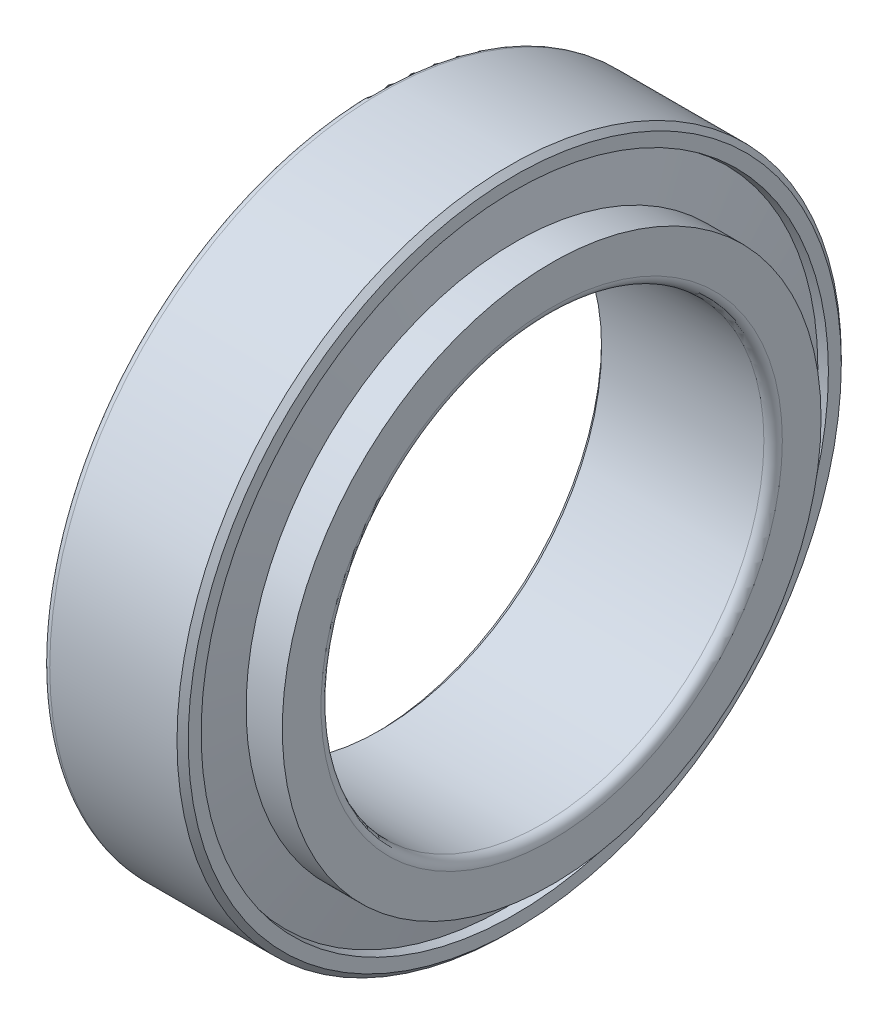
ISO-10303-21;
HEADER;
FILE_DESCRIPTION(('STEP AP214'),'2;1');
FILE_NAME('part.step','',(''),(''),'','','');
FILE_SCHEMA(('AUTOMOTIVE_DESIGN { 1 0 10303 214 1 1 1 1 }'));
ENDSEC;
DATA;
#1=APPLICATION_CONTEXT('core data for automotive mechanical design processes');
#2=APPLICATION_PROTOCOL_DEFINITION('international standard','automotive_design',2000,#1);
#3=PRODUCT_CONTEXT('',#1,'mechanical');
#4=PRODUCT('Part','Part','',(#3));
#5=PRODUCT_RELATED_PRODUCT_CATEGORY('part','',(#4));
#6=PRODUCT_DEFINITION_FORMATION('','',#4);
#7=PRODUCT_DEFINITION_CONTEXT('part definition',#1,'design');
#8=PRODUCT_DEFINITION('design','',#6,#7);
#9=PRODUCT_DEFINITION_SHAPE('','',#8);
#10=(LENGTH_UNIT() NAMED_UNIT(*) SI_UNIT(.MILLI.,.METRE.));
#11=(NAMED_UNIT(*) PLANE_ANGLE_UNIT() SI_UNIT($,.RADIAN.));
#12=(NAMED_UNIT(*) SI_UNIT($,.STERADIAN.) SOLID_ANGLE_UNIT());
#13=UNCERTAINTY_MEASURE_WITH_UNIT(LENGTH_MEASURE(1.E-05),#10,'distance_accuracy_value','');
#14=(GEOMETRIC_REPRESENTATION_CONTEXT(3) GLOBAL_UNCERTAINTY_ASSIGNED_CONTEXT((#13)) GLOBAL_UNIT_ASSIGNED_CONTEXT((#10,
#11,#12)) REPRESENTATION_CONTEXT('',''));
#15=CARTESIAN_POINT('',(0.,0.,0.));
#16=DIRECTION('',(0.,0.,1.));
#17=DIRECTION('',(1.,0.,0.));
#18=AXIS2_PLACEMENT_3D('',#15,#16,#17);
#19=CARTESIAN_POINT('',(-48.,0.,0.));
#20=DIRECTION('',(1.,0.,0.));
#21=DIRECTION('',(0.,0.,-1.));
#22=AXIS2_PLACEMENT_3D('',#19,#20,#21);
#23=CONICAL_SURFACE('',#22,77.3885,0.197222205475353);
#24=CARTESIAN_POINT('',(-45.925265954732,0.,0.));
#25=DIRECTION('',(-1.,0.,0.));
#26=DIRECTION('',(0.,0.,1.));
#27=AXIS2_PLACEMENT_3D('',#24,#25,#26);
#28=CIRCLE('',#27,77.8030727712264);
#29=CARTESIAN_POINT('',(-45.925265954732,0.,77.8030727712264));
#30=VERTEX_POINT('',#29);
#31=EDGE_CURVE('E41',#30,#30,#28,.T.);
#32=ORIENTED_EDGE('',*,*,#31,.F.);
#33=EDGE_LOOP('',(#32));
#34=FACE_BOUND('',#33,.T.);
#35=CARTESIAN_POINT('',(-48.,0.,0.));
#36=DIRECTION('',(1.,0.,0.));
#37=DIRECTION('',(0.,0.,-1.));
#38=AXIS2_PLACEMENT_3D('',#35,#36,#37);
#39=CIRCLE('',#38,77.3885);
#40=CARTESIAN_POINT('',(-48.,0.,-77.3885));
#41=VERTEX_POINT('',#40);
#42=EDGE_CURVE('E53',#41,#41,#39,.T.);
#43=ORIENTED_EDGE('',*,*,#42,.F.);
#44=EDGE_LOOP('',(#43));
#45=FACE_BOUND('',#44,.T.);
#46=ADVANCED_FACE('F30',(#34,#45),#23,.F.);
#47=CARTESIAN_POINT('',(-10.,88.48,0.));
#48=DIRECTION('',(1.,0.,0.));
#49=DIRECTION('',(0.,0.,-1.));
#50=AXIS2_PLACEMENT_3D('',#47,#48,#49);
#51=PLANE('',#50);
#52=CARTESIAN_POINT('',(-10.,0.,0.));
#53=DIRECTION('',(1.,0.,0.));
#54=DIRECTION('',(0.,0.,-1.));
#55=AXIS2_PLACEMENT_3D('',#52,#53,#54);
#56=CIRCLE('',#55,88.48);
#57=CARTESIAN_POINT('',(-10.,0.,-88.48));
#58=VERTEX_POINT('',#57);
#59=EDGE_CURVE('E65',#58,#58,#56,.T.);
#60=ORIENTED_EDGE('',*,*,#59,.T.);
#61=EDGE_LOOP('',(#60));
#62=FACE_BOUND('',#61,.T.);
#63=CARTESIAN_POINT('',(-10.,0.,0.));
#64=DIRECTION('',(1.,0.,0.));
#65=DIRECTION('',(0.,0.,-1.));
#66=AXIS2_PLACEMENT_3D('',#63,#64,#65);
#67=CIRCLE('',#66,84.9816492725707);
#68=CARTESIAN_POINT('',(-10.,0.,-84.9816492725707));
#69=VERTEX_POINT('',#68);
#70=EDGE_CURVE('E50',#69,#69,#67,.T.);
#71=ORIENTED_EDGE('',*,*,#70,.F.);
#72=EDGE_LOOP('',(#71));
#73=FACE_BOUND('',#72,.T.);
#74=ADVANCED_FACE('F32',(#62,#73),#51,.T.);
#75=CARTESIAN_POINT('',(-12.3882446324378,0.,0.));
#76=DIRECTION('',(-1.,0.,0.));
#77=DIRECTION('',(0.,0.,1.));
#78=AXIS2_PLACEMENT_3D('',#75,#76,#77);
#79=CIRCLE('',#78,84.5044309043203);
#80=CARTESIAN_POINT('',(-12.3882446324378,0.,84.5044309043203));
#81=VERTEX_POINT('',#80);
#82=EDGE_CURVE('E45',#81,#81,#79,.F.);
#83=ORIENTED_EDGE('',*,*,#82,.F.);
#84=EDGE_LOOP('',(#83));
#85=FACE_BOUND('',#84,.T.);
#86=ORIENTED_EDGE('',*,*,#70,.T.);
#87=EDGE_LOOP('',(#86));
#88=FACE_BOUND('',#87,.T.);
#89=ADVANCED_FACE('F118',(#85,#88),#23,.F.);
#90=CARTESIAN_POINT('',(-48.,77.3885,0.));
#91=DIRECTION('',(-1.,0.,0.));
#92=DIRECTION('',(0.,0.,1.));
#93=AXIS2_PLACEMENT_3D('',#90,#91,#92);
#94=PLANE('',#93);
#95=ORIENTED_EDGE('',*,*,#42,.T.);
#96=EDGE_LOOP('',(#95));
#97=FACE_BOUND('',#96,.T.);
#98=CARTESIAN_POINT('',(-48.,0.,0.));
#99=DIRECTION('',(1.,0.,0.));
#100=DIRECTION('',(0.,0.,-1.));
#101=AXIS2_PLACEMENT_3D('',#98,#99,#100);
#102=CIRCLE('',#101,88.);
#103=CARTESIAN_POINT('',(-48.,0.,-88.));
#104=VERTEX_POINT('',#103);
#105=EDGE_CURVE('E56',#104,#104,#102,.T.);
#106=ORIENTED_EDGE('',*,*,#105,.F.);
#107=EDGE_LOOP('',(#106));
#108=FACE_BOUND('',#107,.T.);
#109=ADVANCED_FACE('F127',(#97,#108),#94,.T.);
#110=CARTESIAN_POINT('',(-46.,0.,0.));
#111=DIRECTION('',(1.,0.,0.));
#112=DIRECTION('',(0.,0.,-1.));
#113=AXIS2_PLACEMENT_3D('',#110,#111,#112);
#114=TOROIDAL_SURFACE('',#113,88.,2.);
#115=ORIENTED_EDGE('',*,*,#105,.T.);
#116=EDGE_LOOP('',(#115));
#117=FACE_BOUND('',#116,.T.);
#118=CARTESIAN_POINT('',(-46.,0.,0.));
#119=DIRECTION('',(1.,0.,0.));
#120=DIRECTION('',(0.,0.,-1.));
#121=AXIS2_PLACEMENT_3D('',#118,#119,#120);
#122=CIRCLE('',#121,90.);
#123=CARTESIAN_POINT('',(-46.,0.,-90.));
#124=VERTEX_POINT('',#123);
#125=EDGE_CURVE('E59',#124,#124,#122,.T.);
#126=ORIENTED_EDGE('',*,*,#125,.F.);
#127=EDGE_LOOP('',(#126));
#128=FACE_BOUND('',#127,.T.);
#129=ADVANCED_FACE('F132',(#117,#128),#114,.T.);
#130=CARTESIAN_POINT('',(-42.5,0.,0.));
#131=DIRECTION('',(1.,0.,0.));
#132=DIRECTION('',(0.,0.,-1.));
#133=AXIS2_PLACEMENT_3D('',#130,#131,#132);
#134=CYLINDRICAL_SURFACE('',#133,90.);
#135=ORIENTED_EDGE('',*,*,#125,.T.);
#136=EDGE_LOOP('',(#135));
#137=FACE_BOUND('',#136,.T.);
#138=CARTESIAN_POINT('',(-11.52,0.,0.));
#139=DIRECTION('',(1.,0.,0.));
#140=DIRECTION('',(0.,0.,-1.));
#141=AXIS2_PLACEMENT_3D('',#138,#139,#140);
#142=CIRCLE('',#141,90.);
#143=CARTESIAN_POINT('',(-11.52,0.,-90.));
#144=VERTEX_POINT('',#143);
#145=EDGE_CURVE('E62',#144,#144,#142,.T.);
#146=ORIENTED_EDGE('',*,*,#145,.F.);
#147=EDGE_LOOP('',(#146));
#148=FACE_BOUND('',#147,.T.);
#149=ADVANCED_FACE('F154',(#137,#148),#134,.T.);
#150=CARTESIAN_POINT('',(-10.,0.,0.));
#151=DIRECTION('',(-1.,0.,0.));
#152=DIRECTION('',(0.,0.,1.));
#153=AXIS2_PLACEMENT_3D('',#150,#151,#152);
#154=CONICAL_SURFACE('',#153,88.48,0.785398163397444);
#155=ORIENTED_EDGE('',*,*,#145,.T.);
#156=EDGE_LOOP('',(#155));
#157=FACE_BOUND('',#156,.T.);
#158=ORIENTED_EDGE('',*,*,#59,.F.);
#159=EDGE_LOOP('',(#158));
#160=FACE_BOUND('',#159,.T.);
#161=ADVANCED_FACE('F148',(#157,#160),#154,.T.);
#162=CARTESIAN_POINT('',(-46.,0.,0.));
#163=DIRECTION('',(-1.,0.,0.));
#164=DIRECTION('',(0.,0.,1.));
#165=AXIS2_PLACEMENT_3D('',#162,#163,#164);
#166=CONICAL_SURFACE('',#165,78.1770801321044,1.37357412131954);
#167=CARTESIAN_POINT('',(-43.489605362054,0.,0.));
#168=DIRECTION('',(-1.,0.,0.));
#169=DIRECTION('',(0.,0.,1.));
#170=AXIS2_PLACEMENT_3D('',#167,#168,#169);
#171=CIRCLE('',#170,65.613782241129);
#172=CARTESIAN_POINT('',(-43.489605362054,0.,65.613782241129));
#173=VERTEX_POINT('',#172);
#174=EDGE_CURVE('E10',#173,#173,#171,.T.);
#175=ORIENTED_EDGE('',*,*,#174,.F.);
#176=EDGE_LOOP('',(#175));
#177=FACE_BOUND('',#176,.T.);
#178=ORIENTED_EDGE('',*,*,#31,.T.);
#179=EDGE_LOOP('',(#178));
#180=FACE_BOUND('',#179,.T.);
#181=ADVANCED_FACE('F142',(#177,#180),#166,.F.);
#182=CARTESIAN_POINT('',(-43.3547270527261,0.,0.));
#183=DIRECTION('',(1.,0.,0.));
#184=DIRECTION('',(0.,0.,-1.));
#185=AXIS2_PLACEMENT_3D('',#182,#183,#184);
#186=CONICAL_SURFACE('',#185,64.9387822417251,0.197222205475352);
#187=CARTESIAN_POINT('',(-43.3420085158256,0.,0.));
#188=DIRECTION('',(-1.,0.,0.));
#189=DIRECTION('',(0.,0.,1.));
#190=AXIS2_PLACEMENT_3D('',#187,#188,#189);
#191=CIRCLE('',#190,64.9413236561781);
#192=CARTESIAN_POINT('',(-43.3420085158256,0.,64.9413236561781));
#193=VERTEX_POINT('',#192);
#194=EDGE_CURVE('E37',#193,#193,#191,.F.);
#195=ORIENTED_EDGE('',*,*,#194,.F.);
#196=EDGE_LOOP('',(#195));
#197=FACE_BOUND('',#196,.T.);
#198=CARTESIAN_POINT('',(-9.81770573043189,0.,0.));
#199=DIRECTION('',(1.,0.,0.));
#200=DIRECTION('',(0.,0.,-1.));
#201=AXIS2_PLACEMENT_3D('',#198,#199,#200);
#202=CIRCLE('',#201,71.640140374819);
#203=CARTESIAN_POINT('',(-9.81770573043189,0.,-71.640140374819));
#204=VERTEX_POINT('',#203);
#205=EDGE_CURVE('E68',#204,#204,#202,.T.);
#206=ORIENTED_EDGE('',*,*,#205,.T.);
#207=EDGE_LOOP('',(#206));
#208=FACE_BOUND('',#207,.T.);
#209=ADVANCED_FACE('F113',(#197,#208),#186,.F.);
#210=CARTESIAN_POINT('',(-9.81770573043189,0.,0.));
#211=DIRECTION('',(-1.,0.,0.));
#212=DIRECTION('',(0.,0.,1.));
#213=AXIS2_PLACEMENT_3D('',#210,#211,#212);
#214=CONICAL_SURFACE('',#213,71.640140374819,1.37357412131954);
#215=ORIENTED_EDGE('',*,*,#82,.T.);
#216=EDGE_LOOP('',(#215));
#217=FACE_BOUND('',#216,.T.);
#218=ORIENTED_EDGE('',*,*,#205,.F.);
#219=EDGE_LOOP('',(#218));
#220=FACE_BOUND('',#219,.T.);
#221=ADVANCED_FACE('F105',(#217,#220),#214,.T.);
#222=CARTESIAN_POINT('',(-43.3415006909879,0.,0.));
#223=DIRECTION('',(-1.,0.,0.));
#224=DIRECTION('',(0.,0.,1.));
#225=AXIS2_PLACEMENT_3D('',#222,#223,#224);
#226=CONICAL_SURFACE('',#225,64.938782241129,1.37357412131954);
#227=ORIENTED_EDGE('',*,*,#194,.T.);
#228=EDGE_LOOP('',(#227));
#229=FACE_BOUND('',#228,.T.);
#230=CARTESIAN_POINT('',(-43.3415006909879,0.,0.));
#231=DIRECTION('',(1.,0.,0.));
#232=DIRECTION('',(0.,0.,-1.));
#233=AXIS2_PLACEMENT_3D('',#230,#231,#232);
#234=CIRCLE('',#233,64.938782241129);
#235=CARTESIAN_POINT('',(-43.3415006909879,0.,-64.938782241129));
#236=VERTEX_POINT('',#235);
#237=EDGE_CURVE('E95',#236,#236,#234,.T.);
#238=ORIENTED_EDGE('',*,*,#237,.F.);
#239=EDGE_LOOP('',(#238));
#240=FACE_BOUND('',#239,.T.);
#241=ADVANCED_FACE('F102',(#229,#240),#226,.T.);
#242=CARTESIAN_POINT('',(-42.5,0.,0.));
#243=DIRECTION('',(1.,0.,0.));
#244=DIRECTION('',(0.,0.,-1.));
#245=AXIS2_PLACEMENT_3D('',#242,#243,#244);
#246=CYLINDRICAL_SURFACE('',#245,65.613782241129);
#247=ORIENTED_EDGE('',*,*,#174,.T.);
#248=EDGE_LOOP('',(#247));
#249=FACE_BOUND('',#248,.T.);
#250=CARTESIAN_POINT('',(-48.,0.,0.));
#251=DIRECTION('',(1.,0.,0.));
#252=DIRECTION('',(0.,0.,-1.));
#253=AXIS2_PLACEMENT_3D('',#250,#251,#252);
#254=CIRCLE('',#253,65.613782241129);
#255=CARTESIAN_POINT('',(-48.,0.,-65.613782241129));
#256=VERTEX_POINT('',#255);
#257=EDGE_CURVE('E71',#256,#256,#254,.T.);
#258=ORIENTED_EDGE('',*,*,#257,.T.);
#259=EDGE_LOOP('',(#258));
#260=FACE_BOUND('',#259,.T.);
#261=ADVANCED_FACE('F104',(#249,#260),#246,.T.);
#262=CARTESIAN_POINT('',(-48.,65.613782241129,0.));
#263=DIRECTION('',(-1.,0.,0.));
#264=DIRECTION('',(0.,0.,1.));
#265=AXIS2_PLACEMENT_3D('',#262,#263,#264);
#266=PLANE('',#265);
#267=CARTESIAN_POINT('',(-48.,0.,0.));
#268=DIRECTION('',(1.,0.,0.));
#269=DIRECTION('',(0.,0.,-1.));
#270=AXIS2_PLACEMENT_3D('',#267,#268,#269);
#271=CIRCLE('',#270,61.52);
#272=CARTESIAN_POINT('',(-48.,0.,-61.52));
#273=VERTEX_POINT('',#272);
#274=EDGE_CURVE('E74',#273,#273,#271,.T.);
#275=ORIENTED_EDGE('',*,*,#274,.T.);
#276=EDGE_LOOP('',(#275));
#277=FACE_BOUND('',#276,.T.);
#278=ORIENTED_EDGE('',*,*,#257,.F.);
#279=EDGE_LOOP('',(#278));
#280=FACE_BOUND('',#279,.T.);
#281=ADVANCED_FACE('F111',(#277,#280),#266,.T.);
#282=CARTESIAN_POINT('',(-48.,0.,0.));
#283=DIRECTION('',(-1.,0.,0.));
#284=DIRECTION('',(0.,0.,1.));
#285=AXIS2_PLACEMENT_3D('',#282,#283,#284);
#286=CONICAL_SURFACE('',#285,61.52,0.785398163397448);
#287=CARTESIAN_POINT('',(-46.48,0.,0.));
#288=DIRECTION('',(1.,0.,0.));
#289=DIRECTION('',(0.,0.,-1.));
#290=AXIS2_PLACEMENT_3D('',#287,#288,#289);
#291=CIRCLE('',#290,60.);
#292=CARTESIAN_POINT('',(-46.48,0.,-60.));
#293=VERTEX_POINT('',#292);
#294=EDGE_CURVE('E77',#293,#293,#291,.T.);
#295=ORIENTED_EDGE('',*,*,#294,.T.);
#296=EDGE_LOOP('',(#295));
#297=FACE_BOUND('',#296,.T.);
#298=ORIENTED_EDGE('',*,*,#274,.F.);
#299=EDGE_LOOP('',(#298));
#300=FACE_BOUND('',#299,.T.);
#301=ADVANCED_FACE('F212',(#297,#300),#286,.F.);
#302=CARTESIAN_POINT('',(-42.5,0.,0.));
#303=DIRECTION('',(1.,0.,0.));
#304=DIRECTION('',(0.,0.,-1.));
#305=AXIS2_PLACEMENT_3D('',#302,#303,#304);
#306=CYLINDRICAL_SURFACE('',#305,60.);
#307=CARTESIAN_POINT('',(-2.5,0.,0.));
#308=DIRECTION('',(1.,0.,0.));
#309=DIRECTION('',(0.,0.,-1.));
#310=AXIS2_PLACEMENT_3D('',#307,#308,#309);
#311=CIRCLE('',#310,60.);
#312=CARTESIAN_POINT('',(-2.5,0.,-60.));
#313=VERTEX_POINT('',#312);
#314=EDGE_CURVE('E80',#313,#313,#311,.T.);
#315=ORIENTED_EDGE('',*,*,#314,.T.);
#316=EDGE_LOOP('',(#315));
#317=FACE_BOUND('',#316,.T.);
#318=ORIENTED_EDGE('',*,*,#294,.F.);
#319=EDGE_LOOP('',(#318));
#320=FACE_BOUND('',#319,.T.);
#321=ADVANCED_FACE('F222',(#317,#320),#306,.F.);
#322=CARTESIAN_POINT('',(-2.5,0.,0.));
#323=DIRECTION('',(1.,0.,0.));
#324=DIRECTION('',(0.,0.,-1.));
#325=AXIS2_PLACEMENT_3D('',#322,#323,#324);
#326=TOROIDAL_SURFACE('',#325,62.5,2.5);
#327=CARTESIAN_POINT('',(0.,0.,0.));
#328=DIRECTION('',(1.,0.,0.));
#329=DIRECTION('',(0.,0.,-1.));
#330=AXIS2_PLACEMENT_3D('',#327,#328,#329);
#331=CIRCLE('',#330,62.5);
#332=CARTESIAN_POINT('',(0.,0.,-62.5));
#333=VERTEX_POINT('',#332);
#334=EDGE_CURVE('E83',#333,#333,#331,.T.);
#335=ORIENTED_EDGE('',*,*,#334,.T.);
#336=EDGE_LOOP('',(#335));
#337=FACE_BOUND('',#336,.T.);
#338=ORIENTED_EDGE('',*,*,#314,.F.);
#339=EDGE_LOOP('',(#338));
#340=FACE_BOUND('',#339,.T.);
#341=ADVANCED_FACE('F232',(#337,#340),#326,.T.);
#342=CARTESIAN_POINT('',(0.,62.5,0.));
#343=DIRECTION('',(1.,0.,0.));
#344=DIRECTION('',(0.,0.,-1.));
#345=AXIS2_PLACEMENT_3D('',#342,#343,#344);
#346=PLANE('',#345);
#347=CARTESIAN_POINT('',(0.,0.,0.));
#348=DIRECTION('',(1.,0.,0.));
#349=DIRECTION('',(0.,0.,-1.));
#350=AXIS2_PLACEMENT_3D('',#347,#348,#349);
#351=CIRCLE('',#350,72.9901403742229);
#352=CARTESIAN_POINT('',(0.,0.,-72.9901403742229));
#353=VERTEX_POINT('',#352);
#354=EDGE_CURVE('E86',#353,#353,#351,.T.);
#355=ORIENTED_EDGE('',*,*,#354,.T.);
#356=EDGE_LOOP('',(#355));
#357=FACE_BOUND('',#356,.T.);
#358=ORIENTED_EDGE('',*,*,#334,.F.);
#359=EDGE_LOOP('',(#358));
#360=FACE_BOUND('',#359,.T.);
#361=ADVANCED_FACE('F242',(#357,#360),#346,.T.);
#362=CARTESIAN_POINT('',(-42.5,0.,0.));
#363=DIRECTION('',(1.,0.,0.));
#364=DIRECTION('',(0.,0.,-1.));
#365=AXIS2_PLACEMENT_3D('',#362,#363,#364);
#366=CYLINDRICAL_SURFACE('',#365,72.9901403742229);
#367=CARTESIAN_POINT('',(-9.80447936869372,0.,0.));
#368=DIRECTION('',(1.,0.,0.));
#369=DIRECTION('',(0.,0.,-1.));
#370=AXIS2_PLACEMENT_3D('',#367,#368,#369);
#371=CIRCLE('',#370,72.9901403742229);
#372=CARTESIAN_POINT('',(-9.80447936869372,0.,-72.9901403742229));
#373=VERTEX_POINT('',#372);
#374=EDGE_CURVE('E89',#373,#373,#371,.T.);
#375=ORIENTED_EDGE('',*,*,#374,.T.);
#376=EDGE_LOOP('',(#375));
#377=FACE_BOUND('',#376,.T.);
#378=ORIENTED_EDGE('',*,*,#354,.F.);
#379=EDGE_LOOP('',(#378));
#380=FACE_BOUND('',#379,.T.);
#381=ADVANCED_FACE('F252',(#377,#380),#366,.T.);
#382=CARTESIAN_POINT('',(-9.80447936869372,72.9901403742229,0.));
#383=DIRECTION('',(-1.,0.,0.));
#384=DIRECTION('',(0.,0.,1.));
#385=AXIS2_PLACEMENT_3D('',#382,#383,#384);
#386=PLANE('',#385);
#387=CARTESIAN_POINT('',(-9.80447936869372,0.,0.));
#388=DIRECTION('',(1.,0.,0.));
#389=DIRECTION('',(0.,0.,-1.));
#390=AXIS2_PLACEMENT_3D('',#387,#388,#389);
#391=CIRCLE('',#390,71.6401403742229);
#392=CARTESIAN_POINT('',(-9.80447936869372,0.,-71.6401403742229));
#393=VERTEX_POINT('',#392);
#394=EDGE_CURVE('E92',#393,#393,#391,.T.);
#395=ORIENTED_EDGE('',*,*,#394,.T.);
#396=EDGE_LOOP('',(#395));
#397=FACE_BOUND('',#396,.T.);
#398=ORIENTED_EDGE('',*,*,#374,.F.);
#399=EDGE_LOOP('',(#398));
#400=FACE_BOUND('',#399,.T.);
#401=ADVANCED_FACE('F262',(#397,#400),#386,.T.);
#402=CARTESIAN_POINT('',(-9.80447936869372,0.,0.));
#403=DIRECTION('',(1.,0.,0.));
#404=DIRECTION('',(0.,0.,-1.));
#405=AXIS2_PLACEMENT_3D('',#402,#403,#404);
#406=CONICAL_SURFACE('',#405,71.6401403742229,0.197222205475352);
#407=ORIENTED_EDGE('',*,*,#237,.T.);
#408=EDGE_LOOP('',(#407));
#409=FACE_BOUND('',#408,.T.);
#410=ORIENTED_EDGE('',*,*,#394,.F.);
#411=EDGE_LOOP('',(#410));
#412=FACE_BOUND('',#411,.T.);
#413=ADVANCED_FACE('F99',(#409,#412),#406,.T.);
#414=CLOSED_SHELL('',(#46,#74,#89,#109,#129,#149,#161,#181,#209,#221,#241,#261,#281,#301,#321,
#341,#361,#381,#401,#413));
#415=MANIFOLD_SOLID_BREP('B2',#414);
#416=ADVANCED_BREP_SHAPE_REPRESENTATION('',(#18,#415),#14);
#417=SHAPE_DEFINITION_REPRESENTATION(#9,#416);
ENDSEC;
END-ISO-10303-21;
